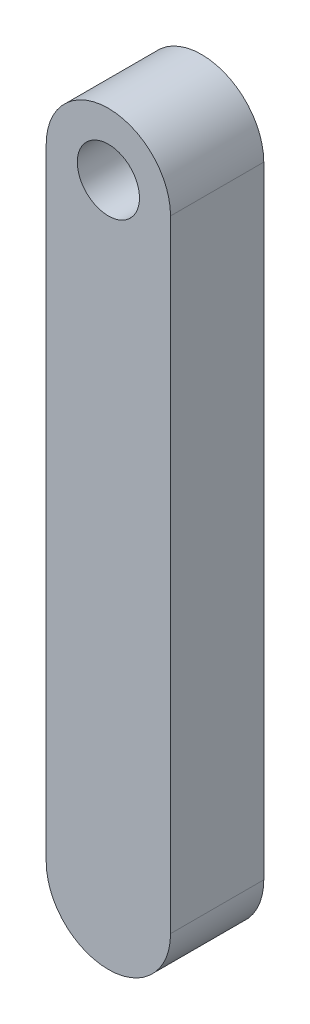
ISO-10303-21;
HEADER;
FILE_DESCRIPTION(('STEP AP214'),'2;1');
FILE_NAME('part.step','',(''),(''),'','','');
FILE_SCHEMA(('AUTOMOTIVE_DESIGN { 1 0 10303 214 1 1 1 1 }'));
ENDSEC;
DATA;
#1=APPLICATION_CONTEXT('core data for automotive mechanical design processes');
#2=APPLICATION_PROTOCOL_DEFINITION('international standard','automotive_design',2000,#1);
#3=PRODUCT_CONTEXT('',#1,'mechanical');
#4=PRODUCT('Part','Part','',(#3));
#5=PRODUCT_RELATED_PRODUCT_CATEGORY('part','',(#4));
#6=PRODUCT_DEFINITION_FORMATION('','',#4);
#7=PRODUCT_DEFINITION_CONTEXT('part definition',#1,'design');
#8=PRODUCT_DEFINITION('design','',#6,#7);
#9=PRODUCT_DEFINITION_SHAPE('','',#8);
#10=(LENGTH_UNIT() NAMED_UNIT(*) SI_UNIT(.MILLI.,.METRE.));
#11=(NAMED_UNIT(*) PLANE_ANGLE_UNIT() SI_UNIT($,.RADIAN.));
#12=(NAMED_UNIT(*) SI_UNIT($,.STERADIAN.) SOLID_ANGLE_UNIT());
#13=UNCERTAINTY_MEASURE_WITH_UNIT(LENGTH_MEASURE(1.E-05),#10,'distance_accuracy_value','');
#14=(GEOMETRIC_REPRESENTATION_CONTEXT(3) GLOBAL_UNCERTAINTY_ASSIGNED_CONTEXT((#13)) GLOBAL_UNIT_ASSIGNED_CONTEXT((#10,
#11,#12)) REPRESENTATION_CONTEXT('',''));
#15=CARTESIAN_POINT('',(0.,0.,0.));
#16=DIRECTION('',(0.,0.,1.));
#17=DIRECTION('',(1.,0.,0.));
#18=AXIS2_PLACEMENT_3D('',#15,#16,#17);
#19=CARTESIAN_POINT('',(0.,18.9738812103863,4.5));
#20=DIRECTION('',(0.,0.,1.));
#21=DIRECTION('',(1.,0.,0.));
#22=AXIS2_PLACEMENT_3D('',#19,#20,#21);
#23=PLANE('',#22);
#24=CARTESIAN_POINT('',(0.,18.9738812103863,4.5));
#25=DIRECTION('',(0.,0.,1.));
#26=DIRECTION('',(1.,0.,0.));
#27=AXIS2_PLACEMENT_3D('',#24,#25,#26);
#28=CIRCLE('',#27,3.);
#29=CARTESIAN_POINT('',(3.,18.9738812103863,4.5));
#30=VERTEX_POINT('',#29);
#31=CARTESIAN_POINT('',(-3.,18.9738812103863,4.5));
#32=VERTEX_POINT('',#31);
#33=EDGE_CURVE('E88',#30,#32,#28,.T.);
#34=ORIENTED_EDGE('',*,*,#33,.T.);
#35=DIRECTION('',(0.,-1.,0.));
#36=VECTOR('',#35,1.);
#37=CARTESIAN_POINT('',(-3.,18.9738812103863,4.5));
#38=LINE('',#37,#36);
#39=CARTESIAN_POINT('',(-3.,-11.0261187896137,4.5));
#40=VERTEX_POINT('',#39);
#41=EDGE_CURVE('E83',#32,#40,#38,.T.);
#42=ORIENTED_EDGE('',*,*,#41,.T.);
#43=CARTESIAN_POINT('',(0.,-11.0261187896137,4.5));
#44=DIRECTION('',(0.,0.,1.));
#45=DIRECTION('',(1.,0.,0.));
#46=AXIS2_PLACEMENT_3D('',#43,#44,#45);
#47=CIRCLE('',#46,3.);
#48=CARTESIAN_POINT('',(3.,-11.0261187896137,4.5));
#49=VERTEX_POINT('',#48);
#50=EDGE_CURVE('E86',#40,#49,#47,.T.);
#51=ORIENTED_EDGE('',*,*,#50,.T.);
#52=DIRECTION('',(0.,1.,0.));
#53=VECTOR('',#52,1.);
#54=CARTESIAN_POINT('',(3.,18.9738812103863,4.5));
#55=LINE('',#54,#53);
#56=EDGE_CURVE('E53',#49,#30,#55,.T.);
#57=ORIENTED_EDGE('',*,*,#56,.T.);
#58=EDGE_LOOP('',(#34,#42,#51,#57));
#59=FACE_BOUND('',#58,.T.);
#60=CARTESIAN_POINT('',(0.,18.9738812103863,4.5));
#61=DIRECTION('',(0.,0.,1.));
#62=DIRECTION('',(1.,0.,0.));
#63=AXIS2_PLACEMENT_3D('',#60,#61,#62);
#64=CIRCLE('',#63,1.5);
#65=CARTESIAN_POINT('',(1.5,18.9738812103863,4.5));
#66=VERTEX_POINT('',#65);
#67=EDGE_CURVE('E103',#66,#66,#64,.T.);
#68=ORIENTED_EDGE('',*,*,#67,.F.);
#69=EDGE_LOOP('',(#68));
#70=FACE_BOUND('',#69,.T.);
#71=ADVANCED_FACE('F36',(#59,#70),#23,.T.);
#72=CARTESIAN_POINT('',(0.,18.9738812103863,0.));
#73=DIRECTION('',(0.,0.,1.));
#74=DIRECTION('',(1.,0.,0.));
#75=AXIS2_PLACEMENT_3D('',#72,#73,#74);
#76=PLANE('',#75);
#77=CARTESIAN_POINT('',(0.,18.9738812103863,0.));
#78=DIRECTION('',(0.,0.,1.));
#79=DIRECTION('',(1.,0.,0.));
#80=AXIS2_PLACEMENT_3D('',#77,#78,#79);
#81=CIRCLE('',#80,3.);
#82=CARTESIAN_POINT('',(3.,18.9738812103863,0.));
#83=VERTEX_POINT('',#82);
#84=CARTESIAN_POINT('',(-3.,18.9738812103863,0.));
#85=VERTEX_POINT('',#84);
#86=EDGE_CURVE('E100',#83,#85,#81,.T.);
#87=ORIENTED_EDGE('',*,*,#86,.F.);
#88=DIRECTION('',(0.,1.,0.));
#89=VECTOR('',#88,1.);
#90=CARTESIAN_POINT('',(3.,18.9738812103863,0.));
#91=LINE('',#90,#89);
#92=CARTESIAN_POINT('',(3.,-11.0261187896137,0.));
#93=VERTEX_POINT('',#92);
#94=EDGE_CURVE('E76',#93,#83,#91,.T.);
#95=ORIENTED_EDGE('',*,*,#94,.F.);
#96=CARTESIAN_POINT('',(0.,-11.0261187896137,0.));
#97=DIRECTION('',(0.,0.,1.));
#98=DIRECTION('',(1.,0.,0.));
#99=AXIS2_PLACEMENT_3D('',#96,#97,#98);
#100=CIRCLE('',#99,3.);
#101=CARTESIAN_POINT('',(-3.,-11.0261187896137,0.));
#102=VERTEX_POINT('',#101);
#103=EDGE_CURVE('E70',#102,#93,#100,.T.);
#104=ORIENTED_EDGE('',*,*,#103,.F.);
#105=DIRECTION('',(0.,-1.,0.));
#106=VECTOR('',#105,1.);
#107=CARTESIAN_POINT('',(-3.,18.9738812103863,0.));
#108=LINE('',#107,#106);
#109=EDGE_CURVE('E92',#85,#102,#108,.T.);
#110=ORIENTED_EDGE('',*,*,#109,.F.);
#111=EDGE_LOOP('',(#87,#95,#104,#110));
#112=FACE_BOUND('',#111,.T.);
#113=CARTESIAN_POINT('',(0.,18.9738812103863,0.));
#114=DIRECTION('',(0.,0.,1.));
#115=DIRECTION('',(1.,0.,0.));
#116=AXIS2_PLACEMENT_3D('',#113,#114,#115);
#117=CIRCLE('',#116,1.5);
#118=CARTESIAN_POINT('',(1.5,18.9738812103863,0.));
#119=VERTEX_POINT('',#118);
#120=EDGE_CURVE('E115',#119,#119,#117,.T.);
#121=ORIENTED_EDGE('',*,*,#120,.T.);
#122=EDGE_LOOP('',(#121));
#123=FACE_BOUND('',#122,.T.);
#124=ADVANCED_FACE('F111',(#112,#123),#76,.F.);
#125=CARTESIAN_POINT('',(0.,18.9738812103863,4.5));
#126=DIRECTION('',(0.,0.,-1.));
#127=DIRECTION('',(-1.,0.,0.));
#128=AXIS2_PLACEMENT_3D('',#125,#126,#127);
#129=CYLINDRICAL_SURFACE('',#128,3.);
#130=ORIENTED_EDGE('',*,*,#86,.T.);
#131=DIRECTION('',(0.,0.,-1.));
#132=VECTOR('',#131,1.);
#133=CARTESIAN_POINT('',(-3.,18.9738812103863,4.5));
#134=LINE('',#133,#132);
#135=EDGE_CURVE('E11',#32,#85,#134,.T.);
#136=ORIENTED_EDGE('',*,*,#135,.F.);
#137=ORIENTED_EDGE('',*,*,#33,.F.);
#138=DIRECTION('',(0.,0.,-1.));
#139=VECTOR('',#138,1.);
#140=CARTESIAN_POINT('',(3.,18.9738812103863,4.5));
#141=LINE('',#140,#139);
#142=EDGE_CURVE('E96',#30,#83,#141,.T.);
#143=ORIENTED_EDGE('',*,*,#142,.T.);
#144=EDGE_LOOP('',(#130,#136,#137,#143));
#145=FACE_BOUND('',#144,.T.);
#146=ADVANCED_FACE('F38',(#145),#129,.T.);
#147=CARTESIAN_POINT('',(-3.,18.9738812103863,4.5));
#148=DIRECTION('',(1.,0.,0.));
#149=DIRECTION('',(0.,1.,0.));
#150=AXIS2_PLACEMENT_3D('',#147,#148,#149);
#151=PLANE('',#150);
#152=ORIENTED_EDGE('',*,*,#109,.T.);
#153=DIRECTION('',(0.,0.,-1.));
#154=VECTOR('',#153,1.);
#155=CARTESIAN_POINT('',(-3.,-11.0261187896137,4.5));
#156=LINE('',#155,#154);
#157=EDGE_CURVE('E45',#40,#102,#156,.T.);
#158=ORIENTED_EDGE('',*,*,#157,.F.);
#159=ORIENTED_EDGE('',*,*,#41,.F.);
#160=ORIENTED_EDGE('',*,*,#135,.T.);
#161=EDGE_LOOP('',(#152,#158,#159,#160));
#162=FACE_BOUND('',#161,.T.);
#163=ADVANCED_FACE('F91',(#162),#151,.F.);
#164=CARTESIAN_POINT('',(0.,-11.0261187896137,4.5));
#165=DIRECTION('',(0.,0.,-1.));
#166=DIRECTION('',(-1.,0.,0.));
#167=AXIS2_PLACEMENT_3D('',#164,#165,#166);
#168=CYLINDRICAL_SURFACE('',#167,3.);
#169=ORIENTED_EDGE('',*,*,#103,.T.);
#170=DIRECTION('',(0.,0.,-1.));
#171=VECTOR('',#170,1.);
#172=CARTESIAN_POINT('',(3.,-11.0261187896137,4.5));
#173=LINE('',#172,#171);
#174=EDGE_CURVE('E93',#49,#93,#173,.T.);
#175=ORIENTED_EDGE('',*,*,#174,.F.);
#176=ORIENTED_EDGE('',*,*,#50,.F.);
#177=ORIENTED_EDGE('',*,*,#157,.T.);
#178=EDGE_LOOP('',(#169,#175,#176,#177));
#179=FACE_BOUND('',#178,.T.);
#180=ADVANCED_FACE('F94',(#179),#168,.T.);
#181=CARTESIAN_POINT('',(3.,18.9738812103863,4.5));
#182=DIRECTION('',(-1.,0.,0.));
#183=DIRECTION('',(0.,-1.,0.));
#184=AXIS2_PLACEMENT_3D('',#181,#182,#183);
#185=PLANE('',#184);
#186=ORIENTED_EDGE('',*,*,#94,.T.);
#187=ORIENTED_EDGE('',*,*,#142,.F.);
#188=ORIENTED_EDGE('',*,*,#56,.F.);
#189=ORIENTED_EDGE('',*,*,#174,.T.);
#190=EDGE_LOOP('',(#186,#187,#188,#189));
#191=FACE_BOUND('',#190,.T.);
#192=ADVANCED_FACE('F108',(#191),#185,.F.);
#193=CARTESIAN_POINT('',(0.,18.9738812103863,4.5));
#194=DIRECTION('',(0.,0.,-1.));
#195=DIRECTION('',(-1.,0.,0.));
#196=AXIS2_PLACEMENT_3D('',#193,#194,#195);
#197=CYLINDRICAL_SURFACE('',#196,1.5);
#198=ORIENTED_EDGE('',*,*,#67,.T.);
#199=EDGE_LOOP('',(#198));
#200=FACE_BOUND('',#199,.T.);
#201=ORIENTED_EDGE('',*,*,#120,.F.);
#202=EDGE_LOOP('',(#201));
#203=FACE_BOUND('',#202,.T.);
#204=ADVANCED_FACE('F121',(#200,#203),#197,.F.);
#205=CLOSED_SHELL('',(#71,#124,#146,#163,#180,#192,#204));
#206=MANIFOLD_SOLID_BREP('B2',#205);
#207=ADVANCED_BREP_SHAPE_REPRESENTATION('',(#18,#206),#14);
#208=SHAPE_DEFINITION_REPRESENTATION(#9,#207);
ENDSEC;
END-ISO-10303-21;
